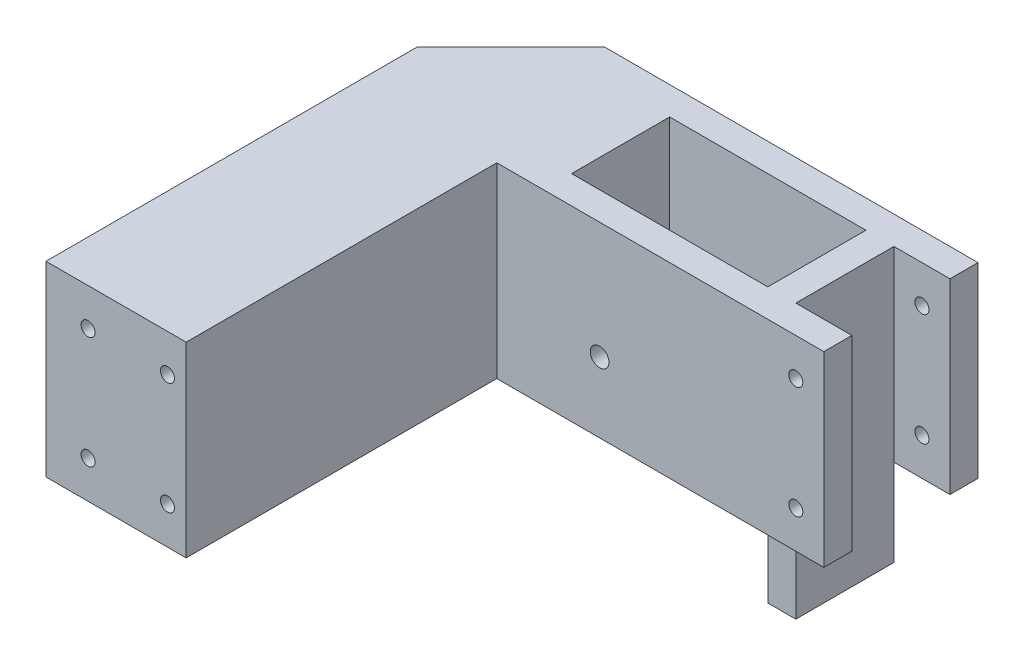
ISO-10303-21;
HEADER;
FILE_DESCRIPTION(('STEP AP214'),'2;1');
FILE_NAME('part.step','',(''),(''),'','','');
FILE_SCHEMA(('AUTOMOTIVE_DESIGN { 1 0 10303 214 1 1 1 1 }'));
ENDSEC;
DATA;
#1=APPLICATION_CONTEXT('core data for automotive mechanical design processes');
#2=APPLICATION_PROTOCOL_DEFINITION('international standard','automotive_design',2000,#1);
#3=PRODUCT_CONTEXT('',#1,'mechanical');
#4=PRODUCT('Part','Part','',(#3));
#5=PRODUCT_RELATED_PRODUCT_CATEGORY('part','',(#4));
#6=PRODUCT_DEFINITION_FORMATION('','',#4);
#7=PRODUCT_DEFINITION_CONTEXT('part definition',#1,'design');
#8=PRODUCT_DEFINITION('design','',#6,#7);
#9=PRODUCT_DEFINITION_SHAPE('','',#8);
#10=(LENGTH_UNIT() NAMED_UNIT(*) SI_UNIT(.MILLI.,.METRE.));
#11=(NAMED_UNIT(*) PLANE_ANGLE_UNIT() SI_UNIT($,.RADIAN.));
#12=(NAMED_UNIT(*) SI_UNIT($,.STERADIAN.) SOLID_ANGLE_UNIT());
#13=UNCERTAINTY_MEASURE_WITH_UNIT(LENGTH_MEASURE(1.E-05),#10,'distance_accuracy_value','');
#14=(GEOMETRIC_REPRESENTATION_CONTEXT(3) GLOBAL_UNCERTAINTY_ASSIGNED_CONTEXT((#13)) GLOBAL_UNIT_ASSIGNED_CONTEXT((#10,
#11,#12)) REPRESENTATION_CONTEXT('',''));
#15=CARTESIAN_POINT('',(0.,0.,0.));
#16=DIRECTION('',(0.,0.,1.));
#17=DIRECTION('',(1.,0.,0.));
#18=AXIS2_PLACEMENT_3D('',#15,#16,#17);
#19=CARTESIAN_POINT('',(20.,40.,-6.));
#20=DIRECTION('',(0.,0.,1.));
#21=DIRECTION('',(1.,0.,0.));
#22=AXIS2_PLACEMENT_3D('',#19,#20,#21);
#23=PLANE('',#22);
#24=CARTESIAN_POINT('',(32.,15.,-6.));
#25=DIRECTION('',(0.,0.,1.));
#26=DIRECTION('',(1.,0.,0.));
#27=AXIS2_PLACEMENT_3D('',#24,#25,#26);
#28=CIRCLE('',#27,2.);
#29=CARTESIAN_POINT('',(34.,15.,-6.));
#30=VERTEX_POINT('',#29);
#31=EDGE_CURVE('E200',#30,#30,#28,.T.);
#32=ORIENTED_EDGE('',*,*,#31,.T.);
#33=EDGE_LOOP('',(#32));
#34=FACE_BOUND('',#33,.T.);
#35=DIRECTION('',(0.,1.,0.));
#36=VECTOR('',#35,1.);
#37=CARTESIAN_POINT('',(62.,-18.6,-6.));
#38=LINE('',#37,#36);
#39=CARTESIAN_POINT('',(62.,0.,-6.));
#40=VERTEX_POINT('',#39);
#41=CARTESIAN_POINT('',(62.,40.,-6.));
#42=VERTEX_POINT('',#41);
#43=EDGE_CURVE('E209',#40,#42,#38,.T.);
#44=ORIENTED_EDGE('',*,*,#43,.F.);
#45=DIRECTION('',(-1.,0.,0.));
#46=VECTOR('',#45,1.);
#47=CARTESIAN_POINT('',(20.,0.,-6.));
#48=LINE('',#47,#46);
#49=CARTESIAN_POINT('',(20.,0.,-6.));
#50=VERTEX_POINT('',#49);
#51=EDGE_CURVE('E314',#40,#50,#48,.T.);
#52=ORIENTED_EDGE('',*,*,#51,.T.);
#53=DIRECTION('',(0.,-1.,0.));
#54=VECTOR('',#53,1.);
#55=CARTESIAN_POINT('',(20.,40.,-6.));
#56=LINE('',#55,#54);
#57=CARTESIAN_POINT('',(20.,40.,-6.));
#58=VERTEX_POINT('',#57);
#59=EDGE_CURVE('E334',#58,#50,#56,.T.);
#60=ORIENTED_EDGE('',*,*,#59,.F.);
#61=DIRECTION('',(-1.,0.,0.));
#62=VECTOR('',#61,1.);
#63=CARTESIAN_POINT('',(20.,40.,-6.));
#64=LINE('',#63,#62);
#65=EDGE_CURVE('E303',#42,#58,#64,.T.);
#66=ORIENTED_EDGE('',*,*,#65,.F.);
#67=EDGE_LOOP('',(#44,#52,#60,#66));
#68=FACE_BOUND('',#67,.T.);
#69=ADVANCED_FACE('F41',(#34,#68),#23,.F.);
#70=CARTESIAN_POINT('',(80.,40.,-27.0000000000001));
#71=DIRECTION('',(0.,0.,-1.));
#72=DIRECTION('',(-1.,0.,0.));
#73=AXIS2_PLACEMENT_3D('',#70,#71,#72);
#74=PLANE('',#73);
#75=CARTESIAN_POINT('',(74.,8.,-27.0000000000001));
#76=DIRECTION('',(0.,0.,-1.));
#77=DIRECTION('',(-1.,0.,0.));
#78=AXIS2_PLACEMENT_3D('',#75,#76,#77);
#79=CIRCLE('',#78,1.5);
#80=CARTESIAN_POINT('',(72.5,8.,-27.0000000000001));
#81=VERTEX_POINT('',#80);
#82=EDGE_CURVE('E283',#81,#81,#79,.T.);
#83=ORIENTED_EDGE('',*,*,#82,.T.);
#84=EDGE_LOOP('',(#83));
#85=FACE_BOUND('',#84,.T.);
#86=CARTESIAN_POINT('',(74.,32.,-27.0000000000001));
#87=DIRECTION('',(0.,0.,-1.));
#88=DIRECTION('',(-1.,0.,0.));
#89=AXIS2_PLACEMENT_3D('',#86,#87,#88);
#90=CIRCLE('',#89,1.5);
#91=CARTESIAN_POINT('',(72.5,32.,-27.0000000000001));
#92=VERTEX_POINT('',#91);
#93=EDGE_CURVE('E293',#92,#92,#90,.T.);
#94=ORIENTED_EDGE('',*,*,#93,.T.);
#95=EDGE_LOOP('',(#94));
#96=FACE_BOUND('',#95,.T.);
#97=DIRECTION('',(0.,1.,0.));
#98=VECTOR('',#97,1.);
#99=CARTESIAN_POINT('',(68.,-18.6,-27.0000000000001));
#100=LINE('',#99,#98);
#101=CARTESIAN_POINT('',(68.,0.,-27.0000000000001));
#102=VERTEX_POINT('',#101);
#103=CARTESIAN_POINT('',(68.,40.,-27.0000000000001));
#104=VERTEX_POINT('',#103);
#105=EDGE_CURVE('E166',#102,#104,#100,.T.);
#106=ORIENTED_EDGE('',*,*,#105,.F.);
#107=DIRECTION('',(1.,0.,0.));
#108=VECTOR('',#107,1.);
#109=CARTESIAN_POINT('',(80.,0.,-27.0000000000001));
#110=LINE('',#109,#108);
#111=CARTESIAN_POINT('',(80.,0.,-27.0000000000001));
#112=VERTEX_POINT('',#111);
#113=EDGE_CURVE('E321',#102,#112,#110,.T.);
#114=ORIENTED_EDGE('',*,*,#113,.T.);
#115=DIRECTION('',(0.,-1.,0.));
#116=VECTOR('',#115,1.);
#117=CARTESIAN_POINT('',(80.,40.,-27.0000000000001));
#118=LINE('',#117,#116);
#119=CARTESIAN_POINT('',(80.,40.,-27.0000000000001));
#120=VERTEX_POINT('',#119);
#121=EDGE_CURVE('E171',#120,#112,#118,.T.);
#122=ORIENTED_EDGE('',*,*,#121,.F.);
#123=DIRECTION('',(1.,0.,0.));
#124=VECTOR('',#123,1.);
#125=CARTESIAN_POINT('',(80.,40.,-27.0000000000001));
#126=LINE('',#125,#124);
#127=EDGE_CURVE('E164',#104,#120,#126,.T.);
#128=ORIENTED_EDGE('',*,*,#127,.F.);
#129=EDGE_LOOP('',(#106,#114,#122,#128));
#130=FACE_BOUND('',#129,.T.);
#131=ADVANCED_FACE('F170',(#85,#96,#130),#74,.F.);
#132=CARTESIAN_POINT('',(0.,40.,0.));
#133=DIRECTION('',(0.,0.,-1.));
#134=DIRECTION('',(-1.,0.,0.));
#135=AXIS2_PLACEMENT_3D('',#132,#133,#134);
#136=PLANE('',#135);
#137=CARTESIAN_POINT('',(32.,15.,0.));
#138=DIRECTION('',(0.,0.,1.));
#139=DIRECTION('',(1.,0.,0.));
#140=AXIS2_PLACEMENT_3D('',#137,#138,#139);
#141=CIRCLE('',#140,2.);
#142=CARTESIAN_POINT('',(34.,15.,0.));
#143=VERTEX_POINT('',#142);
#144=EDGE_CURVE('E461',#143,#143,#141,.T.);
#145=ORIENTED_EDGE('',*,*,#144,.F.);
#146=EDGE_LOOP('',(#145));
#147=FACE_BOUND('',#146,.T.);
#148=CARTESIAN_POINT('',(74.,32.,0.));
#149=DIRECTION('',(0.,0.,-1.));
#150=DIRECTION('',(-1.,0.,0.));
#151=AXIS2_PLACEMENT_3D('',#148,#149,#150);
#152=CIRCLE('',#151,1.5);
#153=CARTESIAN_POINT('',(72.5,32.,0.));
#154=VERTEX_POINT('',#153);
#155=EDGE_CURVE('E275',#154,#154,#152,.T.);
#156=ORIENTED_EDGE('',*,*,#155,.T.);
#157=EDGE_LOOP('',(#156));
#158=FACE_BOUND('',#157,.T.);
#159=CARTESIAN_POINT('',(74.,8.,0.));
#160=DIRECTION('',(0.,0.,-1.));
#161=DIRECTION('',(-1.,0.,0.));
#162=AXIS2_PLACEMENT_3D('',#159,#160,#161);
#163=CIRCLE('',#162,1.5);
#164=CARTESIAN_POINT('',(72.5,8.,0.));
#165=VERTEX_POINT('',#164);
#166=EDGE_CURVE('E279',#165,#165,#163,.T.);
#167=ORIENTED_EDGE('',*,*,#166,.T.);
#168=EDGE_LOOP('',(#167));
#169=FACE_BOUND('',#168,.T.);
#170=DIRECTION('',(1.,0.,0.));
#171=VECTOR('',#170,1.);
#172=CARTESIAN_POINT('',(0.,40.,0.));
#173=LINE('',#172,#171);
#174=CARTESIAN_POINT('',(10.,40.,0.));
#175=VERTEX_POINT('',#174);
#176=CARTESIAN_POINT('',(80.,40.,0.));
#177=VERTEX_POINT('',#176);
#178=EDGE_CURVE('E296',#175,#177,#173,.T.);
#179=ORIENTED_EDGE('',*,*,#178,.F.);
#180=DIRECTION('',(0.,-1.,0.));
#181=VECTOR('',#180,1.);
#182=CARTESIAN_POINT('',(10.,40.,0.));
#183=LINE('',#182,#181);
#184=CARTESIAN_POINT('',(10.,0.,0.));
#185=VERTEX_POINT('',#184);
#186=EDGE_CURVE('E11',#175,#185,#183,.T.);
#187=ORIENTED_EDGE('',*,*,#186,.T.);
#188=DIRECTION('',(1.,0.,0.));
#189=VECTOR('',#188,1.);
#190=CARTESIAN_POINT('',(0.,0.,0.));
#191=LINE('',#190,#189);
#192=CARTESIAN_POINT('',(80.,0.,0.));
#193=VERTEX_POINT('',#192);
#194=EDGE_CURVE('E300',#185,#193,#191,.T.);
#195=ORIENTED_EDGE('',*,*,#194,.T.);
#196=DIRECTION('',(0.,-1.,0.));
#197=VECTOR('',#196,1.);
#198=CARTESIAN_POINT('',(80.,40.,0.));
#199=LINE('',#198,#197);
#200=EDGE_CURVE('E49',#177,#193,#199,.T.);
#201=ORIENTED_EDGE('',*,*,#200,.F.);
#202=EDGE_LOOP('',(#179,#187,#195,#201));
#203=FACE_BOUND('',#202,.T.);
#204=ADVANCED_FACE('F43',(#147,#158,#169,#203),#136,.F.);
#205=CARTESIAN_POINT('',(80.,40.,-6.));
#206=DIRECTION('',(-1.,0.,0.));
#207=DIRECTION('',(0.,0.,1.));
#208=AXIS2_PLACEMENT_3D('',#205,#206,#207);
#209=PLANE('',#208);
#210=DIRECTION('',(0.,0.,-1.));
#211=VECTOR('',#210,1.);
#212=CARTESIAN_POINT('',(80.,0.,-6.));
#213=LINE('',#212,#211);
#214=CARTESIAN_POINT('',(80.,0.,-6.));
#215=VERTEX_POINT('',#214);
#216=EDGE_CURVE('E312',#193,#215,#213,.T.);
#217=ORIENTED_EDGE('',*,*,#216,.T.);
#218=DIRECTION('',(0.,-1.,0.));
#219=VECTOR('',#218,1.);
#220=CARTESIAN_POINT('',(80.,40.,-6.));
#221=LINE('',#220,#219);
#222=CARTESIAN_POINT('',(80.,40.,-6.));
#223=VERTEX_POINT('',#222);
#224=EDGE_CURVE('E336',#223,#215,#221,.T.);
#225=ORIENTED_EDGE('',*,*,#224,.F.);
#226=DIRECTION('',(0.,0.,-1.));
#227=VECTOR('',#226,1.);
#228=CARTESIAN_POINT('',(80.,40.,-6.));
#229=LINE('',#228,#227);
#230=EDGE_CURVE('E297',#177,#223,#229,.T.);
#231=ORIENTED_EDGE('',*,*,#230,.F.);
#232=ORIENTED_EDGE('',*,*,#200,.T.);
#233=EDGE_LOOP('',(#217,#225,#231,#232));
#234=FACE_BOUND('',#233,.T.);
#235=ADVANCED_FACE('F395',(#234),#209,.F.);
#236=CARTESIAN_POINT('',(74.,32.,-6.));
#237=DIRECTION('',(0.,0.,1.));
#238=DIRECTION('',(1.,0.,0.));
#239=AXIS2_PLACEMENT_3D('',#236,#237,#238);
#240=CIRCLE('',#239,1.5);
#241=CARTESIAN_POINT('',(75.5,32.,-6.));
#242=VERTEX_POINT('',#241);
#243=EDGE_CURVE('E295',#242,#242,#240,.T.);
#244=ORIENTED_EDGE('',*,*,#243,.T.);
#245=EDGE_LOOP('',(#244));
#246=FACE_BOUND('',#245,.T.);
#247=CARTESIAN_POINT('',(74.,8.,-6.));
#248=DIRECTION('',(0.,0.,1.));
#249=DIRECTION('',(1.,0.,0.));
#250=AXIS2_PLACEMENT_3D('',#247,#248,#249);
#251=CIRCLE('',#250,1.5);
#252=CARTESIAN_POINT('',(75.5,8.,-6.));
#253=VERTEX_POINT('',#252);
#254=EDGE_CURVE('E286',#253,#253,#251,.T.);
#255=ORIENTED_EDGE('',*,*,#254,.T.);
#256=EDGE_LOOP('',(#255));
#257=FACE_BOUND('',#256,.T.);
#258=CARTESIAN_POINT('',(68.,0.,-6.));
#259=VERTEX_POINT('',#258);
#260=EDGE_CURVE('E317',#215,#259,#48,.T.);
#261=ORIENTED_EDGE('',*,*,#260,.T.);
#262=DIRECTION('',(0.,1.,0.));
#263=VECTOR('',#262,1.);
#264=CARTESIAN_POINT('',(68.,-18.6,-6.));
#265=LINE('',#264,#263);
#266=CARTESIAN_POINT('',(68.,40.,-6.));
#267=VERTEX_POINT('',#266);
#268=EDGE_CURVE('E67',#259,#267,#265,.T.);
#269=ORIENTED_EDGE('',*,*,#268,.T.);
#270=EDGE_CURVE('E186',#223,#267,#64,.T.);
#271=ORIENTED_EDGE('',*,*,#270,.F.);
#272=ORIENTED_EDGE('',*,*,#224,.T.);
#273=EDGE_LOOP('',(#261,#269,#271,#272));
#274=FACE_BOUND('',#273,.T.);
#275=ADVANCED_FACE('F377',(#246,#257,#274),#23,.F.);
#276=CARTESIAN_POINT('',(20.,40.,-27.0000000000001));
#277=DIRECTION('',(-1.,0.,0.));
#278=DIRECTION('',(0.,0.,1.));
#279=AXIS2_PLACEMENT_3D('',#276,#277,#278);
#280=PLANE('',#279);
#281=DIRECTION('',(0.,0.,-1.));
#282=VECTOR('',#281,1.);
#283=CARTESIAN_POINT('',(20.,0.,-27.0000000000001));
#284=LINE('',#283,#282);
#285=CARTESIAN_POINT('',(20.,0.,-27.0000000000001));
#286=VERTEX_POINT('',#285);
#287=EDGE_CURVE('E319',#50,#286,#284,.T.);
#288=ORIENTED_EDGE('',*,*,#287,.T.);
#289=DIRECTION('',(0.,-1.,0.));
#290=VECTOR('',#289,1.);
#291=CARTESIAN_POINT('',(20.,40.,-27.0000000000001));
#292=LINE('',#291,#290);
#293=CARTESIAN_POINT('',(20.,40.,-27.0000000000001));
#294=VERTEX_POINT('',#293);
#295=EDGE_CURVE('E335',#294,#286,#292,.T.);
#296=ORIENTED_EDGE('',*,*,#295,.F.);
#297=DIRECTION('',(0.,0.,-1.));
#298=VECTOR('',#297,1.);
#299=CARTESIAN_POINT('',(20.,40.,-27.0000000000001));
#300=LINE('',#299,#298);
#301=EDGE_CURVE('E176',#58,#294,#300,.T.);
#302=ORIENTED_EDGE('',*,*,#301,.F.);
#303=ORIENTED_EDGE('',*,*,#59,.T.);
#304=EDGE_LOOP('',(#288,#296,#302,#303));
#305=FACE_BOUND('',#304,.T.);
#306=ADVANCED_FACE('F392',(#305),#280,.F.);
#307=CARTESIAN_POINT('',(32.,15.,-27.0000000000001));
#308=DIRECTION('',(0.,0.,-1.));
#309=DIRECTION('',(-1.,0.,0.));
#310=AXIS2_PLACEMENT_3D('',#307,#308,#309);
#311=CIRCLE('',#310,2.);
#312=CARTESIAN_POINT('',(30.,15.,-27.0000000000001));
#313=VERTEX_POINT('',#312);
#314=EDGE_CURVE('E520',#313,#313,#311,.T.);
#315=ORIENTED_EDGE('',*,*,#314,.T.);
#316=EDGE_LOOP('',(#315));
#317=FACE_BOUND('',#316,.T.);
#318=CARTESIAN_POINT('',(62.,0.,-27.0000000000001));
#319=VERTEX_POINT('',#318);
#320=EDGE_CURVE('E325',#286,#319,#110,.T.);
#321=ORIENTED_EDGE('',*,*,#320,.T.);
#322=DIRECTION('',(0.,1.,0.));
#323=VECTOR('',#322,1.);
#324=CARTESIAN_POINT('',(62.,-18.6,-27.0000000000001));
#325=LINE('',#324,#323);
#326=CARTESIAN_POINT('',(62.,40.,-27.0000000000001));
#327=VERTEX_POINT('',#326);
#328=EDGE_CURVE('E59',#319,#327,#325,.T.);
#329=ORIENTED_EDGE('',*,*,#328,.T.);
#330=EDGE_CURVE('E174',#294,#327,#126,.T.);
#331=ORIENTED_EDGE('',*,*,#330,.F.);
#332=ORIENTED_EDGE('',*,*,#295,.T.);
#333=EDGE_LOOP('',(#321,#329,#331,#332));
#334=FACE_BOUND('',#333,.T.);
#335=ADVANCED_FACE('F386',(#317,#334),#74,.F.);
#336=CARTESIAN_POINT('',(80.,40.,-33.0000000000001));
#337=DIRECTION('',(-1.,0.,0.));
#338=DIRECTION('',(0.,0.,1.));
#339=AXIS2_PLACEMENT_3D('',#336,#337,#338);
#340=PLANE('',#339);
#341=DIRECTION('',(0.,0.,-1.));
#342=VECTOR('',#341,1.);
#343=CARTESIAN_POINT('',(80.,0.,-33.0000000000001));
#344=LINE('',#343,#342);
#345=CARTESIAN_POINT('',(80.,0.,-33.0000000000001));
#346=VERTEX_POINT('',#345);
#347=EDGE_CURVE('E323',#112,#346,#344,.T.);
#348=ORIENTED_EDGE('',*,*,#347,.T.);
#349=DIRECTION('',(0.,-1.,0.));
#350=VECTOR('',#349,1.);
#351=CARTESIAN_POINT('',(80.,40.,-33.0000000000001));
#352=LINE('',#351,#350);
#353=CARTESIAN_POINT('',(80.,40.,-33.0000000000001));
#354=VERTEX_POINT('',#353);
#355=EDGE_CURVE('E311',#354,#346,#352,.T.);
#356=ORIENTED_EDGE('',*,*,#355,.F.);
#357=DIRECTION('',(0.,0.,-1.));
#358=VECTOR('',#357,1.);
#359=CARTESIAN_POINT('',(80.,40.,-33.0000000000001));
#360=LINE('',#359,#358);
#361=EDGE_CURVE('E306',#120,#354,#360,.T.);
#362=ORIENTED_EDGE('',*,*,#361,.F.);
#363=ORIENTED_EDGE('',*,*,#121,.T.);
#364=EDGE_LOOP('',(#348,#356,#362,#363));
#365=FACE_BOUND('',#364,.T.);
#366=ADVANCED_FACE('F428',(#365),#340,.F.);
#367=CARTESIAN_POINT('',(0.,40.,-33.0000000000001));
#368=DIRECTION('',(0.,0.,1.));
#369=DIRECTION('',(1.,0.,0.));
#370=AXIS2_PLACEMENT_3D('',#367,#368,#369);
#371=PLANE('',#370);
#372=CARTESIAN_POINT('',(32.,15.,-33.0000000000001));
#373=DIRECTION('',(0.,0.,1.));
#374=DIRECTION('',(1.,0.,0.));
#375=AXIS2_PLACEMENT_3D('',#372,#373,#374);
#376=CIRCLE('',#375,2.);
#377=CARTESIAN_POINT('',(34.,15.,-33.0000000000001));
#378=VERTEX_POINT('',#377);
#379=EDGE_CURVE('E524',#378,#378,#376,.T.);
#380=ORIENTED_EDGE('',*,*,#379,.T.);
#381=EDGE_LOOP('',(#380));
#382=FACE_BOUND('',#381,.T.);
#383=CARTESIAN_POINT('',(5.99999999999999,8.,-33.0000000000001));
#384=DIRECTION('',(0.,0.,-1.));
#385=DIRECTION('',(-1.,0.,0.));
#386=AXIS2_PLACEMENT_3D('',#383,#384,#385);
#387=CIRCLE('',#386,1.5);
#388=CARTESIAN_POINT('',(4.49999999999999,8.,-33.0000000000001));
#389=VERTEX_POINT('',#388);
#390=EDGE_CURVE('E265',#389,#389,#387,.T.);
#391=ORIENTED_EDGE('',*,*,#390,.F.);
#392=EDGE_LOOP('',(#391));
#393=FACE_BOUND('',#392,.T.);
#394=CARTESIAN_POINT('',(5.99999999999999,32.,-33.0000000000001));
#395=DIRECTION('',(0.,0.,-1.));
#396=DIRECTION('',(-1.,0.,0.));
#397=AXIS2_PLACEMENT_3D('',#394,#395,#396);
#398=CIRCLE('',#397,1.5);
#399=CARTESIAN_POINT('',(4.49999999999999,32.,-33.0000000000001));
#400=VERTEX_POINT('',#399);
#401=EDGE_CURVE('E273',#400,#400,#398,.T.);
#402=ORIENTED_EDGE('',*,*,#401,.F.);
#403=EDGE_LOOP('',(#402));
#404=FACE_BOUND('',#403,.T.);
#405=DIRECTION('',(-1.,0.,0.));
#406=VECTOR('',#405,1.);
#407=CARTESIAN_POINT('',(0.,0.,-33.0000000000001));
#408=LINE('',#407,#406);
#409=CARTESIAN_POINT('',(0.,0.,-33.0000000000001));
#410=VERTEX_POINT('',#409);
#411=EDGE_CURVE('E301',#346,#410,#408,.T.);
#412=ORIENTED_EDGE('',*,*,#411,.T.);
#413=DIRECTION('',(0.,1.,0.));
#414=VECTOR('',#413,1.);
#415=CARTESIAN_POINT('',(0.,0.,-33.0000000000001));
#416=LINE('',#415,#414);
#417=CARTESIAN_POINT('',(0.,40.,-33.0000000000001));
#418=VERTEX_POINT('',#417);
#419=EDGE_CURVE('E233',#410,#418,#416,.T.);
#420=ORIENTED_EDGE('',*,*,#419,.T.);
#421=DIRECTION('',(-1.,0.,0.));
#422=VECTOR('',#421,1.);
#423=CARTESIAN_POINT('',(0.,40.,-33.0000000000001));
#424=LINE('',#423,#422);
#425=EDGE_CURVE('E308',#354,#418,#424,.T.);
#426=ORIENTED_EDGE('',*,*,#425,.F.);
#427=ORIENTED_EDGE('',*,*,#355,.T.);
#428=EDGE_LOOP('',(#412,#420,#426,#427));
#429=FACE_BOUND('',#428,.T.);
#430=CARTESIAN_POINT('',(74.,8.,-33.0000000000001));
#431=DIRECTION('',(0.,0.,-1.));
#432=DIRECTION('',(-1.,0.,0.));
#433=AXIS2_PLACEMENT_3D('',#430,#431,#432);
#434=CIRCLE('',#433,1.5);
#435=CARTESIAN_POINT('',(72.5,8.,-33.0000000000001));
#436=VERTEX_POINT('',#435);
#437=EDGE_CURVE('E272',#436,#436,#434,.T.);
#438=ORIENTED_EDGE('',*,*,#437,.F.);
#439=EDGE_LOOP('',(#438));
#440=FACE_BOUND('',#439,.T.);
#441=CARTESIAN_POINT('',(74.,32.,-33.0000000000001));
#442=DIRECTION('',(0.,0.,-1.));
#443=DIRECTION('',(-1.,0.,0.));
#444=AXIS2_PLACEMENT_3D('',#441,#442,#443);
#445=CIRCLE('',#444,1.5);
#446=CARTESIAN_POINT('',(72.5,32.,-33.0000000000001));
#447=VERTEX_POINT('',#446);
#448=EDGE_CURVE('E266',#447,#447,#445,.T.);
#449=ORIENTED_EDGE('',*,*,#448,.F.);
#450=EDGE_LOOP('',(#449));
#451=FACE_BOUND('',#450,.T.);
#452=ADVANCED_FACE('F435',(#382,#393,#404,#429,#440,#451),#371,.F.);
#453=CARTESIAN_POINT('',(0.,40.,0.));
#454=DIRECTION('',(0.,1.,0.));
#455=DIRECTION('',(0.,0.,1.));
#456=AXIS2_PLACEMENT_3D('',#453,#454,#455);
#457=PLANE('',#456);
#458=ORIENTED_EDGE('',*,*,#270,.T.);
#459=DIRECTION('',(0.,0.,-1.));
#460=VECTOR('',#459,1.);
#461=CARTESIAN_POINT('',(68.,40.,0.));
#462=LINE('',#461,#460);
#463=EDGE_CURVE('E185',#267,#104,#462,.T.);
#464=ORIENTED_EDGE('',*,*,#463,.T.);
#465=ORIENTED_EDGE('',*,*,#127,.T.);
#466=ORIENTED_EDGE('',*,*,#361,.T.);
#467=ORIENTED_EDGE('',*,*,#425,.T.);
#468=DIRECTION('',(0.707106781186548,0.,-0.707106781186548));
#469=VECTOR('',#468,1.);
#470=CARTESIAN_POINT('',(0.,40.,-33.0000000000001));
#471=LINE('',#470,#469);
#472=CARTESIAN_POINT('',(-20.,40.,-13.0000000000001));
#473=VERTEX_POINT('',#472);
#474=EDGE_CURVE('E230',#473,#418,#471,.T.);
#475=ORIENTED_EDGE('',*,*,#474,.F.);
#476=DIRECTION('',(0.,0.,1.));
#477=VECTOR('',#476,1.);
#478=CARTESIAN_POINT('',(-20.,40.,-83.0000000000001));
#479=LINE('',#478,#477);
#480=CARTESIAN_POINT('',(-20.,40.,66.5));
#481=VERTEX_POINT('',#480);
#482=EDGE_CURVE('E261',#473,#481,#479,.T.);
#483=ORIENTED_EDGE('',*,*,#482,.T.);
#484=DIRECTION('',(-1.,0.,0.));
#485=VECTOR('',#484,1.);
#486=CARTESIAN_POINT('',(10.,40.,66.5));
#487=LINE('',#486,#485);
#488=CARTESIAN_POINT('',(10.,40.,66.5));
#489=VERTEX_POINT('',#488);
#490=EDGE_CURVE('E249',#489,#481,#487,.T.);
#491=ORIENTED_EDGE('',*,*,#490,.F.);
#492=DIRECTION('',(0.,0.,1.));
#493=VECTOR('',#492,1.);
#494=CARTESIAN_POINT('',(10.,40.,-83.0000000000001));
#495=LINE('',#494,#493);
#496=EDGE_CURVE('E258',#175,#489,#495,.T.);
#497=ORIENTED_EDGE('',*,*,#496,.F.);
#498=ORIENTED_EDGE('',*,*,#178,.T.);
#499=ORIENTED_EDGE('',*,*,#230,.T.);
#500=EDGE_LOOP('',(#458,#464,#465,#466,#467,#475,#483,#491,#497,#498,#499));
#501=FACE_BOUND('',#500,.T.);
#502=DIRECTION('',(0.,0.,1.));
#503=VECTOR('',#502,1.);
#504=CARTESIAN_POINT('',(62.,40.,0.));
#505=LINE('',#504,#503);
#506=EDGE_CURVE('E191',#327,#42,#505,.T.);
#507=ORIENTED_EDGE('',*,*,#506,.T.);
#508=ORIENTED_EDGE('',*,*,#65,.T.);
#509=ORIENTED_EDGE('',*,*,#301,.T.);
#510=ORIENTED_EDGE('',*,*,#330,.T.);
#511=EDGE_LOOP('',(#507,#508,#509,#510));
#512=FACE_BOUND('',#511,.T.);
#513=ADVANCED_FACE('F190',(#501,#512),#457,.T.);
#514=CARTESIAN_POINT('',(0.,0.,0.));
#515=DIRECTION('',(0.,1.,0.));
#516=DIRECTION('',(0.,0.,1.));
#517=AXIS2_PLACEMENT_3D('',#514,#515,#516);
#518=PLANE('',#517);
#519=DIRECTION('',(0.,0.,1.));
#520=VECTOR('',#519,1.);
#521=CARTESIAN_POINT('',(-20.,0.,-83.0000000000001));
#522=LINE('',#521,#520);
#523=CARTESIAN_POINT('',(-20.,0.,-13.0000000000001));
#524=VERTEX_POINT('',#523);
#525=CARTESIAN_POINT('',(-20.,0.,66.5));
#526=VERTEX_POINT('',#525);
#527=EDGE_CURVE('E263',#524,#526,#522,.T.);
#528=ORIENTED_EDGE('',*,*,#527,.F.);
#529=DIRECTION('',(0.707106781186548,0.,-0.707106781186548));
#530=VECTOR('',#529,1.);
#531=CARTESIAN_POINT('',(0.,0.,-33.0000000000001));
#532=LINE('',#531,#530);
#533=EDGE_CURVE('E224',#524,#410,#532,.T.);
#534=ORIENTED_EDGE('',*,*,#533,.T.);
#535=ORIENTED_EDGE('',*,*,#411,.F.);
#536=ORIENTED_EDGE('',*,*,#347,.F.);
#537=ORIENTED_EDGE('',*,*,#113,.F.);
#538=EDGE_CURVE('E324',#319,#102,#110,.T.);
#539=ORIENTED_EDGE('',*,*,#538,.F.);
#540=ORIENTED_EDGE('',*,*,#320,.F.);
#541=ORIENTED_EDGE('',*,*,#287,.F.);
#542=ORIENTED_EDGE('',*,*,#51,.F.);
#543=EDGE_CURVE('E316',#259,#40,#48,.T.);
#544=ORIENTED_EDGE('',*,*,#543,.F.);
#545=ORIENTED_EDGE('',*,*,#260,.F.);
#546=ORIENTED_EDGE('',*,*,#216,.F.);
#547=ORIENTED_EDGE('',*,*,#194,.F.);
#548=DIRECTION('',(0.,0.,1.));
#549=VECTOR('',#548,1.);
#550=CARTESIAN_POINT('',(10.,0.,-83.0000000000001));
#551=LINE('',#550,#549);
#552=CARTESIAN_POINT('',(10.,0.,66.5));
#553=VERTEX_POINT('',#552);
#554=EDGE_CURVE('E259',#185,#553,#551,.T.);
#555=ORIENTED_EDGE('',*,*,#554,.T.);
#556=DIRECTION('',(1.,0.,0.));
#557=VECTOR('',#556,1.);
#558=CARTESIAN_POINT('',(10.,0.,66.5));
#559=LINE('',#558,#557);
#560=EDGE_CURVE('E256',#526,#553,#559,.T.);
#561=ORIENTED_EDGE('',*,*,#560,.F.);
#562=EDGE_LOOP('',(#528,#534,#535,#536,#537,#539,#540,#541,#542,#544,#545,#546,#547,#555,#561));
#563=FACE_BOUND('',#562,.T.);
#564=ADVANCED_FACE('F427',(#563),#518,.F.);
#565=CARTESIAN_POINT('',(74.,8.,0.));
#566=DIRECTION('',(0.,0.,-1.));
#567=DIRECTION('',(-1.,0.,0.));
#568=AXIS2_PLACEMENT_3D('',#565,#566,#567);
#569=CYLINDRICAL_SURFACE('',#568,1.5);
#570=ORIENTED_EDGE('',*,*,#437,.T.);
#571=EDGE_LOOP('',(#570));
#572=FACE_BOUND('',#571,.T.);
#573=ORIENTED_EDGE('',*,*,#82,.F.);
#574=EDGE_LOOP('',(#573));
#575=FACE_BOUND('',#574,.T.);
#576=ADVANCED_FACE('F473',(#572,#575),#569,.F.);
#577=CARTESIAN_POINT('',(74.,32.,0.));
#578=DIRECTION('',(0.,0.,-1.));
#579=DIRECTION('',(-1.,0.,0.));
#580=AXIS2_PLACEMENT_3D('',#577,#578,#579);
#581=CYLINDRICAL_SURFACE('',#580,1.5);
#582=ORIENTED_EDGE('',*,*,#448,.T.);
#583=EDGE_LOOP('',(#582));
#584=FACE_BOUND('',#583,.T.);
#585=ORIENTED_EDGE('',*,*,#93,.F.);
#586=EDGE_LOOP('',(#585));
#587=FACE_BOUND('',#586,.T.);
#588=ADVANCED_FACE('F483',(#584,#587),#581,.F.);
#589=CARTESIAN_POINT('',(5.99999999999999,32.,0.));
#590=DIRECTION('',(0.,0.,-1.));
#591=DIRECTION('',(-1.,0.,0.));
#592=AXIS2_PLACEMENT_3D('',#589,#590,#591);
#593=CYLINDRICAL_SURFACE('',#592,1.5);
#594=ORIENTED_EDGE('',*,*,#401,.T.);
#595=EDGE_LOOP('',(#594));
#596=FACE_BOUND('',#595,.T.);
#597=CARTESIAN_POINT('',(5.99999999999999,32.,66.5));
#598=DIRECTION('',(0.,0.,1.));
#599=DIRECTION('',(1.,0.,0.));
#600=AXIS2_PLACEMENT_3D('',#597,#598,#599);
#601=CIRCLE('',#600,1.5);
#602=CARTESIAN_POINT('',(7.5,32.,66.5));
#603=VERTEX_POINT('',#602);
#604=EDGE_CURVE('E234',#603,#603,#601,.T.);
#605=ORIENTED_EDGE('',*,*,#604,.T.);
#606=EDGE_LOOP('',(#605));
#607=FACE_BOUND('',#606,.T.);
#608=ADVANCED_FACE('F481',(#596,#607),#593,.F.);
#609=CARTESIAN_POINT('',(5.99999999999999,8.,0.));
#610=DIRECTION('',(0.,0.,-1.));
#611=DIRECTION('',(-1.,0.,0.));
#612=AXIS2_PLACEMENT_3D('',#609,#610,#611);
#613=CYLINDRICAL_SURFACE('',#612,1.5);
#614=ORIENTED_EDGE('',*,*,#390,.T.);
#615=EDGE_LOOP('',(#614));
#616=FACE_BOUND('',#615,.T.);
#617=CARTESIAN_POINT('',(5.99999999999999,8.,66.5));
#618=DIRECTION('',(0.,0.,1.));
#619=DIRECTION('',(1.,0.,0.));
#620=AXIS2_PLACEMENT_3D('',#617,#618,#619);
#621=CIRCLE('',#620,1.5);
#622=CARTESIAN_POINT('',(7.49999999999999,8.,66.5));
#623=VERTEX_POINT('',#622);
#624=EDGE_CURVE('E238',#623,#623,#621,.T.);
#625=ORIENTED_EDGE('',*,*,#624,.T.);
#626=EDGE_LOOP('',(#625));
#627=FACE_BOUND('',#626,.T.);
#628=ADVANCED_FACE('F475',(#616,#627),#613,.F.);
#629=ORIENTED_EDGE('',*,*,#166,.F.);
#630=EDGE_LOOP('',(#629));
#631=FACE_BOUND('',#630,.T.);
#632=ORIENTED_EDGE('',*,*,#254,.F.);
#633=EDGE_LOOP('',(#632));
#634=FACE_BOUND('',#633,.T.);
#635=ADVANCED_FACE('F466',(#631,#634),#569,.F.);
#636=ORIENTED_EDGE('',*,*,#155,.F.);
#637=EDGE_LOOP('',(#636));
#638=FACE_BOUND('',#637,.T.);
#639=ORIENTED_EDGE('',*,*,#243,.F.);
#640=EDGE_LOOP('',(#639));
#641=FACE_BOUND('',#640,.T.);
#642=ADVANCED_FACE('F471',(#638,#641),#581,.F.);
#643=CARTESIAN_POINT('',(10.,0.,-83.0000000000001));
#644=DIRECTION('',(1.,0.,0.));
#645=DIRECTION('',(0.,0.,-1.));
#646=AXIS2_PLACEMENT_3D('',#643,#644,#645);
#647=PLANE('',#646);
#648=ORIENTED_EDGE('',*,*,#186,.F.);
#649=ORIENTED_EDGE('',*,*,#496,.T.);
#650=DIRECTION('',(0.,1.,0.));
#651=VECTOR('',#650,1.);
#652=CARTESIAN_POINT('',(10.,0.,66.5));
#653=LINE('',#652,#651);
#654=EDGE_CURVE('E250',#553,#489,#653,.T.);
#655=ORIENTED_EDGE('',*,*,#654,.F.);
#656=ORIENTED_EDGE('',*,*,#554,.F.);
#657=EDGE_LOOP('',(#648,#649,#655,#656));
#658=FACE_BOUND('',#657,.T.);
#659=ADVANCED_FACE('F448',(#658),#647,.T.);
#660=CARTESIAN_POINT('',(-20.,0.,-83.0000000000001));
#661=DIRECTION('',(-1.,0.,0.));
#662=DIRECTION('',(0.,0.,1.));
#663=AXIS2_PLACEMENT_3D('',#660,#661,#662);
#664=PLANE('',#663);
#665=DIRECTION('',(0.,1.,0.));
#666=VECTOR('',#665,1.);
#667=CARTESIAN_POINT('',(-20.,0.,-13.0000000000001));
#668=LINE('',#667,#666);
#669=EDGE_CURVE('E226',#524,#473,#668,.T.);
#670=ORIENTED_EDGE('',*,*,#669,.F.);
#671=ORIENTED_EDGE('',*,*,#527,.T.);
#672=DIRECTION('',(0.,-1.,0.));
#673=VECTOR('',#672,1.);
#674=CARTESIAN_POINT('',(-20.,0.,66.5));
#675=LINE('',#674,#673);
#676=EDGE_CURVE('E254',#481,#526,#675,.T.);
#677=ORIENTED_EDGE('',*,*,#676,.F.);
#678=ORIENTED_EDGE('',*,*,#482,.F.);
#679=EDGE_LOOP('',(#670,#671,#677,#678));
#680=FACE_BOUND('',#679,.T.);
#681=ADVANCED_FACE('F445',(#680),#664,.T.);
#682=CARTESIAN_POINT('',(-11.,32.,-83.0000000000001));
#683=DIRECTION('',(0.,0.,1.));
#684=DIRECTION('',(1.,0.,0.));
#685=AXIS2_PLACEMENT_3D('',#682,#683,#684);
#686=CYLINDRICAL_SURFACE('',#685,1.5);
#687=CARTESIAN_POINT('',(-11.,32.,16.5));
#688=DIRECTION('',(0.,0.,1.));
#689=DIRECTION('',(1.,0.,0.));
#690=AXIS2_PLACEMENT_3D('',#687,#688,#689);
#691=CIRCLE('',#690,1.5);
#692=CARTESIAN_POINT('',(-9.50000000000001,32.,16.5));
#693=VERTEX_POINT('',#692);
#694=EDGE_CURVE('E44',#693,#693,#691,.F.);
#695=ORIENTED_EDGE('',*,*,#694,.T.);
#696=EDGE_LOOP('',(#695));
#697=FACE_BOUND('',#696,.T.);
#698=CARTESIAN_POINT('',(-11.,32.,66.5));
#699=DIRECTION('',(0.,0.,1.));
#700=DIRECTION('',(1.,0.,0.));
#701=AXIS2_PLACEMENT_3D('',#698,#699,#700);
#702=CIRCLE('',#701,1.5);
#703=CARTESIAN_POINT('',(-9.50000000000001,32.,66.5));
#704=VERTEX_POINT('',#703);
#705=EDGE_CURVE('E242',#704,#704,#702,.T.);
#706=ORIENTED_EDGE('',*,*,#705,.T.);
#707=EDGE_LOOP('',(#706));
#708=FACE_BOUND('',#707,.T.);
#709=ADVANCED_FACE('F352',(#697,#708),#686,.F.);
#710=CARTESIAN_POINT('',(-11.,8.,-83.0000000000001));
#711=DIRECTION('',(0.,0.,1.));
#712=DIRECTION('',(1.,0.,0.));
#713=AXIS2_PLACEMENT_3D('',#710,#711,#712);
#714=CYLINDRICAL_SURFACE('',#713,1.5);
#715=CARTESIAN_POINT('',(-11.,8.,16.5));
#716=DIRECTION('',(0.,0.,1.));
#717=DIRECTION('',(1.,0.,0.));
#718=AXIS2_PLACEMENT_3D('',#715,#716,#717);
#719=CIRCLE('',#718,1.5);
#720=CARTESIAN_POINT('',(-9.50000000000001,8.,16.5));
#721=VERTEX_POINT('',#720);
#722=EDGE_CURVE('E350',#721,#721,#719,.F.);
#723=ORIENTED_EDGE('',*,*,#722,.T.);
#724=EDGE_LOOP('',(#723));
#725=FACE_BOUND('',#724,.T.);
#726=CARTESIAN_POINT('',(-11.,8.,66.5));
#727=DIRECTION('',(0.,0.,1.));
#728=DIRECTION('',(1.,0.,0.));
#729=AXIS2_PLACEMENT_3D('',#726,#727,#728);
#730=CIRCLE('',#729,1.5);
#731=CARTESIAN_POINT('',(-9.50000000000001,8.,66.5));
#732=VERTEX_POINT('',#731);
#733=EDGE_CURVE('E241',#732,#732,#730,.T.);
#734=ORIENTED_EDGE('',*,*,#733,.T.);
#735=EDGE_LOOP('',(#734));
#736=FACE_BOUND('',#735,.T.);
#737=ADVANCED_FACE('F632',(#725,#736),#714,.F.);
#738=CARTESIAN_POINT('',(0.,0.,66.5));
#739=DIRECTION('',(0.,0.,1.));
#740=DIRECTION('',(1.,0.,0.));
#741=AXIS2_PLACEMENT_3D('',#738,#739,#740);
#742=PLANE('',#741);
#743=ORIENTED_EDGE('',*,*,#624,.F.);
#744=EDGE_LOOP('',(#743));
#745=FACE_BOUND('',#744,.T.);
#746=ORIENTED_EDGE('',*,*,#705,.F.);
#747=EDGE_LOOP('',(#746));
#748=FACE_BOUND('',#747,.T.);
#749=ORIENTED_EDGE('',*,*,#654,.T.);
#750=ORIENTED_EDGE('',*,*,#490,.T.);
#751=ORIENTED_EDGE('',*,*,#676,.T.);
#752=ORIENTED_EDGE('',*,*,#560,.T.);
#753=EDGE_LOOP('',(#749,#750,#751,#752));
#754=FACE_BOUND('',#753,.T.);
#755=ORIENTED_EDGE('',*,*,#733,.F.);
#756=EDGE_LOOP('',(#755));
#757=FACE_BOUND('',#756,.T.);
#758=ORIENTED_EDGE('',*,*,#604,.F.);
#759=EDGE_LOOP('',(#758));
#760=FACE_BOUND('',#759,.T.);
#761=ADVANCED_FACE('F444',(#745,#748,#754,#757,#760),#742,.T.);
#762=CARTESIAN_POINT('',(0.,0.,-33.0000000000001));
#763=DIRECTION('',(0.707106781186548,0.,0.707106781186548));
#764=DIRECTION('',(0.707106781186548,0.,-0.707106781186548));
#765=AXIS2_PLACEMENT_3D('',#762,#763,#764);
#766=PLANE('',#765);
#767=CARTESIAN_POINT('',(-11.,32.,-22.0000000000001));
#768=DIRECTION('',(0.707106781186548,0.,0.707106781186548));
#769=DIRECTION('',(-0.707106781186548,0.,0.707106781186548));
#770=AXIS2_PLACEMENT_3D('',#767,#768,#769);
#771=ELLIPSE('',#770,4.94974746830583,3.5);
#772=CARTESIAN_POINT('',(-14.5,32.,-18.5000000000001));
#773=VERTEX_POINT('',#772);
#774=EDGE_CURVE('E344',#773,#773,#771,.T.);
#775=ORIENTED_EDGE('',*,*,#774,.T.);
#776=EDGE_LOOP('',(#775));
#777=FACE_BOUND('',#776,.T.);
#778=CARTESIAN_POINT('',(-11.,8.,-22.0000000000001));
#779=DIRECTION('',(0.707106781186548,0.,0.707106781186548));
#780=DIRECTION('',(-0.707106781186548,0.,0.707106781186548));
#781=AXIS2_PLACEMENT_3D('',#778,#779,#780);
#782=ELLIPSE('',#781,4.94974746830583,3.5);
#783=CARTESIAN_POINT('',(-14.5,8.,-18.5000000000001));
#784=VERTEX_POINT('',#783);
#785=EDGE_CURVE('E225',#784,#784,#782,.T.);
#786=ORIENTED_EDGE('',*,*,#785,.T.);
#787=EDGE_LOOP('',(#786));
#788=FACE_BOUND('',#787,.T.);
#789=ORIENTED_EDGE('',*,*,#474,.T.);
#790=ORIENTED_EDGE('',*,*,#419,.F.);
#791=ORIENTED_EDGE('',*,*,#533,.F.);
#792=ORIENTED_EDGE('',*,*,#669,.T.);
#793=EDGE_LOOP('',(#789,#790,#791,#792));
#794=FACE_BOUND('',#793,.T.);
#795=ADVANCED_FACE('F617',(#777,#788,#794),#766,.F.);
#796=CARTESIAN_POINT('',(-11.,8.,16.5));
#797=DIRECTION('',(0.,0.,1.));
#798=DIRECTION('',(1.,0.,0.));
#799=AXIS2_PLACEMENT_3D('',#796,#797,#798);
#800=PLANE('',#799);
#801=CARTESIAN_POINT('',(-11.,8.,16.5));
#802=DIRECTION('',(0.,0.,1.));
#803=DIRECTION('',(1.,0.,0.));
#804=AXIS2_PLACEMENT_3D('',#801,#802,#803);
#805=CIRCLE('',#804,3.5);
#806=CARTESIAN_POINT('',(-7.50000000000001,8.,16.5));
#807=VERTEX_POINT('',#806);
#808=EDGE_CURVE('E215',#807,#807,#805,.T.);
#809=ORIENTED_EDGE('',*,*,#808,.F.);
#810=EDGE_LOOP('',(#809));
#811=FACE_BOUND('',#810,.T.);
#812=ORIENTED_EDGE('',*,*,#722,.F.);
#813=EDGE_LOOP('',(#812));
#814=FACE_BOUND('',#813,.T.);
#815=ADVANCED_FACE('F369',(#811,#814),#800,.F.);
#816=CARTESIAN_POINT('',(-11.,8.,-33.0000000000001));
#817=DIRECTION('',(0.,0.,1.));
#818=DIRECTION('',(1.,0.,0.));
#819=AXIS2_PLACEMENT_3D('',#816,#817,#818);
#820=CYLINDRICAL_SURFACE('',#819,3.5);
#821=ORIENTED_EDGE('',*,*,#808,.T.);
#822=EDGE_LOOP('',(#821));
#823=FACE_BOUND('',#822,.T.);
#824=ORIENTED_EDGE('',*,*,#785,.F.);
#825=EDGE_LOOP('',(#824));
#826=FACE_BOUND('',#825,.T.);
#827=ADVANCED_FACE('F359',(#823,#826),#820,.F.);
#828=CARTESIAN_POINT('',(-11.,32.,16.5));
#829=DIRECTION('',(0.,0.,1.));
#830=DIRECTION('',(1.,0.,0.));
#831=AXIS2_PLACEMENT_3D('',#828,#829,#830);
#832=PLANE('',#831);
#833=CARTESIAN_POINT('',(-11.,32.,16.5));
#834=DIRECTION('',(0.,0.,1.));
#835=DIRECTION('',(1.,0.,0.));
#836=AXIS2_PLACEMENT_3D('',#833,#834,#835);
#837=CIRCLE('',#836,3.5);
#838=CARTESIAN_POINT('',(-7.50000000000001,32.,16.5));
#839=VERTEX_POINT('',#838);
#840=EDGE_CURVE('E219',#839,#839,#837,.T.);
#841=ORIENTED_EDGE('',*,*,#840,.F.);
#842=EDGE_LOOP('',(#841));
#843=FACE_BOUND('',#842,.T.);
#844=ORIENTED_EDGE('',*,*,#694,.F.);
#845=EDGE_LOOP('',(#844));
#846=FACE_BOUND('',#845,.T.);
#847=ADVANCED_FACE('F357',(#843,#846),#832,.F.);
#848=CARTESIAN_POINT('',(-11.,32.,-33.0000000000001));
#849=DIRECTION('',(0.,0.,1.));
#850=DIRECTION('',(1.,0.,0.));
#851=AXIS2_PLACEMENT_3D('',#848,#849,#850);
#852=CYLINDRICAL_SURFACE('',#851,3.5);
#853=ORIENTED_EDGE('',*,*,#840,.T.);
#854=EDGE_LOOP('',(#853));
#855=FACE_BOUND('',#854,.T.);
#856=ORIENTED_EDGE('',*,*,#774,.F.);
#857=EDGE_LOOP('',(#856));
#858=FACE_BOUND('',#857,.T.);
#859=ADVANCED_FACE('F360',(#855,#858),#852,.F.);
#860=CARTESIAN_POINT('',(62.,-18.6,0.));
#861=DIRECTION('',(-1.,0.,0.));
#862=DIRECTION('',(0.,0.,1.));
#863=AXIS2_PLACEMENT_3D('',#860,#861,#862);
#864=PLANE('',#863);
#865=CARTESIAN_POINT('',(62.,-18.6,-6.));
#866=VERTEX_POINT('',#865);
#867=EDGE_CURVE('E217',#866,#40,#38,.T.);
#868=ORIENTED_EDGE('',*,*,#867,.T.);
#869=ORIENTED_EDGE('',*,*,#43,.T.);
#870=ORIENTED_EDGE('',*,*,#506,.F.);
#871=ORIENTED_EDGE('',*,*,#328,.F.);
#872=CARTESIAN_POINT('',(62.,-18.6,-27.0000000000001));
#873=VERTEX_POINT('',#872);
#874=EDGE_CURVE('E208',#873,#319,#325,.T.);
#875=ORIENTED_EDGE('',*,*,#874,.F.);
#876=DIRECTION('',(0.,0.,1.));
#877=VECTOR('',#876,1.);
#878=CARTESIAN_POINT('',(62.,-18.6,0.));
#879=LINE('',#878,#877);
#880=EDGE_CURVE('E188',#873,#866,#879,.T.);
#881=ORIENTED_EDGE('',*,*,#880,.T.);
#882=EDGE_LOOP('',(#868,#869,#870,#871,#875,#881));
#883=FACE_BOUND('',#882,.T.);
#884=ADVANCED_FACE('F370',(#883),#864,.T.);
#885=CARTESIAN_POINT('',(0.,-18.6,-27.0000000000001));
#886=DIRECTION('',(0.,0.,-1.));
#887=DIRECTION('',(-1.,0.,0.));
#888=AXIS2_PLACEMENT_3D('',#885,#886,#887);
#889=PLANE('',#888);
#890=ORIENTED_EDGE('',*,*,#874,.T.);
#891=ORIENTED_EDGE('',*,*,#538,.T.);
#892=CARTESIAN_POINT('',(68.,-18.6,-27.0000000000001));
#893=VERTEX_POINT('',#892);
#894=EDGE_CURVE('E183',#893,#102,#100,.T.);
#895=ORIENTED_EDGE('',*,*,#894,.F.);
#896=DIRECTION('',(-1.,0.,0.));
#897=VECTOR('',#896,1.);
#898=CARTESIAN_POINT('',(0.,-18.6,-27.0000000000001));
#899=LINE('',#898,#897);
#900=EDGE_CURVE('E207',#893,#873,#899,.T.);
#901=ORIENTED_EDGE('',*,*,#900,.T.);
#902=EDGE_LOOP('',(#890,#891,#895,#901));
#903=FACE_BOUND('',#902,.T.);
#904=ADVANCED_FACE('F422',(#903),#889,.T.);
#905=CARTESIAN_POINT('',(68.,-18.6,0.));
#906=DIRECTION('',(1.,0.,0.));
#907=DIRECTION('',(0.,0.,-1.));
#908=AXIS2_PLACEMENT_3D('',#905,#906,#907);
#909=PLANE('',#908);
#910=ORIENTED_EDGE('',*,*,#894,.T.);
#911=ORIENTED_EDGE('',*,*,#105,.T.);
#912=ORIENTED_EDGE('',*,*,#463,.F.);
#913=ORIENTED_EDGE('',*,*,#268,.F.);
#914=CARTESIAN_POINT('',(68.,-18.6,-6.));
#915=VERTEX_POINT('',#914);
#916=EDGE_CURVE('E184',#915,#259,#265,.T.);
#917=ORIENTED_EDGE('',*,*,#916,.F.);
#918=DIRECTION('',(0.,0.,-1.));
#919=VECTOR('',#918,1.);
#920=CARTESIAN_POINT('',(68.,-18.6,0.));
#921=LINE('',#920,#919);
#922=EDGE_CURVE('E202',#915,#893,#921,.T.);
#923=ORIENTED_EDGE('',*,*,#922,.T.);
#924=EDGE_LOOP('',(#910,#911,#912,#913,#917,#923));
#925=FACE_BOUND('',#924,.T.);
#926=ADVANCED_FACE('F181',(#925),#909,.T.);
#927=CARTESIAN_POINT('',(0.,-18.6,-6.));
#928=DIRECTION('',(0.,0.,1.));
#929=DIRECTION('',(1.,0.,0.));
#930=AXIS2_PLACEMENT_3D('',#927,#928,#929);
#931=PLANE('',#930);
#932=ORIENTED_EDGE('',*,*,#916,.T.);
#933=ORIENTED_EDGE('',*,*,#543,.T.);
#934=ORIENTED_EDGE('',*,*,#867,.F.);
#935=DIRECTION('',(1.,0.,0.));
#936=VECTOR('',#935,1.);
#937=CARTESIAN_POINT('',(0.,-18.6,-6.));
#938=LINE('',#937,#936);
#939=EDGE_CURVE('E193',#866,#915,#938,.T.);
#940=ORIENTED_EDGE('',*,*,#939,.T.);
#941=EDGE_LOOP('',(#932,#933,#934,#940));
#942=FACE_BOUND('',#941,.T.);
#943=ADVANCED_FACE('F412',(#942),#931,.T.);
#944=CARTESIAN_POINT('',(0.,-18.6,0.));
#945=DIRECTION('',(0.,1.,0.));
#946=DIRECTION('',(0.,0.,1.));
#947=AXIS2_PLACEMENT_3D('',#944,#945,#946);
#948=PLANE('',#947);
#949=ORIENTED_EDGE('',*,*,#880,.F.);
#950=ORIENTED_EDGE('',*,*,#900,.F.);
#951=ORIENTED_EDGE('',*,*,#922,.F.);
#952=ORIENTED_EDGE('',*,*,#939,.F.);
#953=EDGE_LOOP('',(#949,#950,#951,#952));
#954=FACE_BOUND('',#953,.T.);
#955=ADVANCED_FACE('F411',(#954),#948,.F.);
#956=CARTESIAN_POINT('',(32.,15.,-33.0000000000001));
#957=DIRECTION('',(0.,0.,1.));
#958=DIRECTION('',(1.,0.,0.));
#959=AXIS2_PLACEMENT_3D('',#956,#957,#958);
#960=CYLINDRICAL_SURFACE('',#959,2.);
#961=ORIENTED_EDGE('',*,*,#379,.F.);
#962=EDGE_LOOP('',(#961));
#963=FACE_BOUND('',#962,.T.);
#964=ORIENTED_EDGE('',*,*,#314,.F.);
#965=EDGE_LOOP('',(#964));
#966=FACE_BOUND('',#965,.T.);
#967=ADVANCED_FACE('F532',(#963,#966),#960,.F.);
#968=ORIENTED_EDGE('',*,*,#144,.T.);
#969=EDGE_LOOP('',(#968));
#970=FACE_BOUND('',#969,.T.);
#971=ORIENTED_EDGE('',*,*,#31,.F.);
#972=EDGE_LOOP('',(#971));
#973=FACE_BOUND('',#972,.T.);
#974=ADVANCED_FACE('F526',(#970,#973),#960,.F.);
#975=CLOSED_SHELL('',(#69,#131,#204,#235,#275,#306,#335,#366,#452,#513,#564,#576,#588,#608,#628,
#635,#642,#659,#681,#709,#737,#761,#795,#815,#827,#847,#859,#884,#904,#926,#943,#955,#967,#974));
#976=MANIFOLD_SOLID_BREP('B2',#975);
#977=ADVANCED_BREP_SHAPE_REPRESENTATION('',(#18,#976),#14);
#978=SHAPE_DEFINITION_REPRESENTATION(#9,#977);
ENDSEC;
END-ISO-10303-21;
